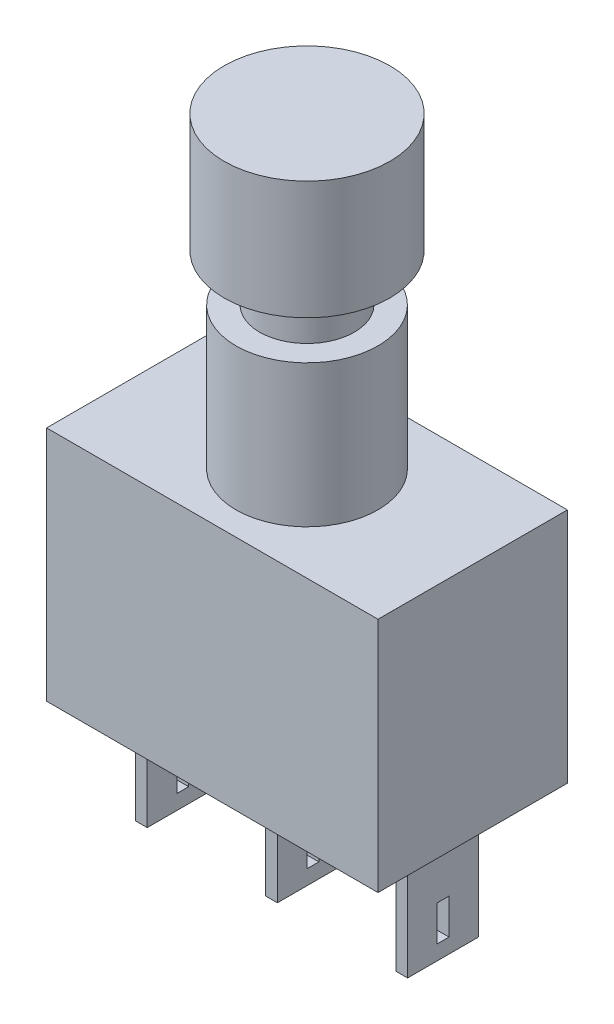
ISO-10303-21;
HEADER;
FILE_DESCRIPTION(('STEP AP214'),'2;1');
FILE_NAME('part.step','',(''),(''),'','','');
FILE_SCHEMA(('AUTOMOTIVE_DESIGN { 1 0 10303 214 1 1 1 1 }'));
ENDSEC;
DATA;
#1=APPLICATION_CONTEXT('core data for automotive mechanical design processes');
#2=APPLICATION_PROTOCOL_DEFINITION('international standard','automotive_design',2000,#1);
#3=PRODUCT_CONTEXT('',#1,'mechanical');
#4=PRODUCT('Part','Part','',(#3));
#5=PRODUCT_RELATED_PRODUCT_CATEGORY('part','',(#4));
#6=PRODUCT_DEFINITION_FORMATION('','',#4);
#7=PRODUCT_DEFINITION_CONTEXT('part definition',#1,'design');
#8=PRODUCT_DEFINITION('design','',#6,#7);
#9=PRODUCT_DEFINITION_SHAPE('','',#8);
#10=(LENGTH_UNIT() NAMED_UNIT(*) SI_UNIT(.MILLI.,.METRE.));
#11=(NAMED_UNIT(*) PLANE_ANGLE_UNIT() SI_UNIT($,.RADIAN.));
#12=(NAMED_UNIT(*) SI_UNIT($,.STERADIAN.) SOLID_ANGLE_UNIT());
#13=UNCERTAINTY_MEASURE_WITH_UNIT(LENGTH_MEASURE(1.E-05),#10,'distance_accuracy_value','');
#14=(GEOMETRIC_REPRESENTATION_CONTEXT(3) GLOBAL_UNCERTAINTY_ASSIGNED_CONTEXT((#13)) GLOBAL_UNIT_ASSIGNED_CONTEXT((#10,
#11,#12)) REPRESENTATION_CONTEXT('',''));
#15=CARTESIAN_POINT('',(0.,0.,0.));
#16=DIRECTION('',(0.,0.,1.));
#17=DIRECTION('',(1.,0.,0.));
#18=AXIS2_PLACEMENT_3D('',#15,#16,#17);
#19=CARTESIAN_POINT('',(-7.,0.,4.));
#20=DIRECTION('',(0.,1.,0.));
#21=DIRECTION('',(0.,0.,1.));
#22=AXIS2_PLACEMENT_3D('',#19,#20,#21);
#23=PLANE('',#22);
#24=DIRECTION('',(0.,0.,1.));
#25=VECTOR('',#24,1.);
#26=CARTESIAN_POINT('',(5.75,0.,1.5));
#27=LINE('',#26,#25);
#28=CARTESIAN_POINT('',(5.75,0.,-1.5));
#29=VERTEX_POINT('',#28);
#30=CARTESIAN_POINT('',(5.75,0.,1.5));
#31=VERTEX_POINT('',#30);
#32=EDGE_CURVE('E347',#29,#31,#27,.T.);
#33=ORIENTED_EDGE('',*,*,#32,.F.);
#34=DIRECTION('',(1.,0.,0.));
#35=VECTOR('',#34,1.);
#36=CARTESIAN_POINT('',(5.75,0.,-1.5));
#37=LINE('',#36,#35);
#38=CARTESIAN_POINT('',(5.25,0.,-1.5));
#39=VERTEX_POINT('',#38);
#40=EDGE_CURVE('E356',#39,#29,#37,.T.);
#41=ORIENTED_EDGE('',*,*,#40,.F.);
#42=DIRECTION('',(0.,0.,-1.));
#43=VECTOR('',#42,1.);
#44=CARTESIAN_POINT('',(5.25,0.,1.5));
#45=LINE('',#44,#43);
#46=CARTESIAN_POINT('',(5.25,0.,1.5));
#47=VERTEX_POINT('',#46);
#48=EDGE_CURVE('E353',#47,#39,#45,.T.);
#49=ORIENTED_EDGE('',*,*,#48,.F.);
#50=DIRECTION('',(-1.,0.,0.));
#51=VECTOR('',#50,1.);
#52=CARTESIAN_POINT('',(5.75,0.,1.5));
#53=LINE('',#52,#51);
#54=EDGE_CURVE('E350',#31,#47,#53,.T.);
#55=ORIENTED_EDGE('',*,*,#54,.F.);
#56=EDGE_LOOP('',(#33,#41,#49,#55));
#57=FACE_BOUND('',#56,.T.);
#58=DIRECTION('',(0.,0.,1.));
#59=VECTOR('',#58,1.);
#60=CARTESIAN_POINT('',(-7.,0.,-4.));
#61=LINE('',#60,#59);
#62=CARTESIAN_POINT('',(-7.,0.,-4.));
#63=VERTEX_POINT('',#62);
#64=CARTESIAN_POINT('',(-7.,0.,4.));
#65=VERTEX_POINT('',#64);
#66=EDGE_CURVE('E431',#63,#65,#61,.T.);
#67=ORIENTED_EDGE('',*,*,#66,.F.);
#68=DIRECTION('',(-1.,0.,0.));
#69=VECTOR('',#68,1.);
#70=CARTESIAN_POINT('',(-7.,0.,-4.));
#71=LINE('',#70,#69);
#72=CARTESIAN_POINT('',(7.,0.,-4.));
#73=VERTEX_POINT('',#72);
#74=EDGE_CURVE('E438',#73,#63,#71,.T.);
#75=ORIENTED_EDGE('',*,*,#74,.F.);
#76=DIRECTION('',(0.,0.,-1.));
#77=VECTOR('',#76,1.);
#78=CARTESIAN_POINT('',(7.,0.,-4.));
#79=LINE('',#78,#77);
#80=CARTESIAN_POINT('',(7.,0.,4.));
#81=VERTEX_POINT('',#80);
#82=EDGE_CURVE('E436',#81,#73,#79,.T.);
#83=ORIENTED_EDGE('',*,*,#82,.F.);
#84=DIRECTION('',(1.,0.,0.));
#85=VECTOR('',#84,1.);
#86=CARTESIAN_POINT('',(-7.,0.,4.));
#87=LINE('',#86,#85);
#88=EDGE_CURVE('E434',#65,#81,#87,.T.);
#89=ORIENTED_EDGE('',*,*,#88,.F.);
#90=EDGE_LOOP('',(#67,#75,#83,#89));
#91=FACE_BOUND('',#90,.T.);
#92=DIRECTION('',(0.,0.,1.));
#93=VECTOR('',#92,1.);
#94=CARTESIAN_POINT('',(0.25,0.,1.5));
#95=LINE('',#94,#93);
#96=CARTESIAN_POINT('',(0.25,0.,-1.5));
#97=VERTEX_POINT('',#96);
#98=CARTESIAN_POINT('',(0.25,0.,1.5));
#99=VERTEX_POINT('',#98);
#100=EDGE_CURVE('E380',#97,#99,#95,.T.);
#101=ORIENTED_EDGE('',*,*,#100,.F.);
#102=DIRECTION('',(1.,0.,0.));
#103=VECTOR('',#102,1.);
#104=CARTESIAN_POINT('',(0.25,0.,-1.5));
#105=LINE('',#104,#103);
#106=CARTESIAN_POINT('',(-0.25,0.,-1.5));
#107=VERTEX_POINT('',#106);
#108=EDGE_CURVE('E389',#107,#97,#105,.T.);
#109=ORIENTED_EDGE('',*,*,#108,.F.);
#110=DIRECTION('',(0.,0.,-1.));
#111=VECTOR('',#110,1.);
#112=CARTESIAN_POINT('',(-0.25,0.,1.5));
#113=LINE('',#112,#111);
#114=CARTESIAN_POINT('',(-0.25,0.,1.5));
#115=VERTEX_POINT('',#114);
#116=EDGE_CURVE('E386',#115,#107,#113,.T.);
#117=ORIENTED_EDGE('',*,*,#116,.F.);
#118=DIRECTION('',(-1.,0.,0.));
#119=VECTOR('',#118,1.);
#120=CARTESIAN_POINT('',(0.25,0.,1.5));
#121=LINE('',#120,#119);
#122=EDGE_CURVE('E383',#99,#115,#121,.T.);
#123=ORIENTED_EDGE('',*,*,#122,.F.);
#124=EDGE_LOOP('',(#101,#109,#117,#123));
#125=FACE_BOUND('',#124,.T.);
#126=DIRECTION('',(0.,0.,1.));
#127=VECTOR('',#126,1.);
#128=CARTESIAN_POINT('',(-5.25,0.,1.5));
#129=LINE('',#128,#127);
#130=CARTESIAN_POINT('',(-5.25,0.,-1.5));
#131=VERTEX_POINT('',#130);
#132=CARTESIAN_POINT('',(-5.25,0.,1.5));
#133=VERTEX_POINT('',#132);
#134=EDGE_CURVE('E314',#131,#133,#129,.T.);
#135=ORIENTED_EDGE('',*,*,#134,.F.);
#136=DIRECTION('',(1.,0.,0.));
#137=VECTOR('',#136,1.);
#138=CARTESIAN_POINT('',(-5.25,0.,-1.5));
#139=LINE('',#138,#137);
#140=CARTESIAN_POINT('',(-5.75,0.,-1.5));
#141=VERTEX_POINT('',#140);
#142=EDGE_CURVE('E323',#141,#131,#139,.T.);
#143=ORIENTED_EDGE('',*,*,#142,.F.);
#144=DIRECTION('',(0.,0.,-1.));
#145=VECTOR('',#144,1.);
#146=CARTESIAN_POINT('',(-5.75,0.,1.5));
#147=LINE('',#146,#145);
#148=CARTESIAN_POINT('',(-5.75,0.,1.5));
#149=VERTEX_POINT('',#148);
#150=EDGE_CURVE('E320',#149,#141,#147,.T.);
#151=ORIENTED_EDGE('',*,*,#150,.F.);
#152=DIRECTION('',(-1.,0.,0.));
#153=VECTOR('',#152,1.);
#154=CARTESIAN_POINT('',(-5.25,0.,1.5));
#155=LINE('',#154,#153);
#156=EDGE_CURVE('E317',#133,#149,#155,.T.);
#157=ORIENTED_EDGE('',*,*,#156,.F.);
#158=EDGE_LOOP('',(#135,#143,#151,#157));
#159=FACE_BOUND('',#158,.T.);
#160=ADVANCED_FACE('F32',(#57,#91,#125,#159),#23,.F.);
#161=CARTESIAN_POINT('',(0.,16.,0.));
#162=DIRECTION('',(0.,1.,0.));
#163=DIRECTION('',(0.,0.,1.));
#164=AXIS2_PLACEMENT_3D('',#161,#162,#163);
#165=PLANE('',#164);
#166=CARTESIAN_POINT('',(0.,16.,0.));
#167=DIRECTION('',(0.,1.,0.));
#168=DIRECTION('',(0.,0.,1.));
#169=AXIS2_PLACEMENT_3D('',#166,#167,#168);
#170=CIRCLE('',#169,3.);
#171=CARTESIAN_POINT('',(0.,16.,3.));
#172=VERTEX_POINT('',#171);
#173=EDGE_CURVE('E428',#172,#172,#170,.T.);
#174=ORIENTED_EDGE('',*,*,#173,.T.);
#175=EDGE_LOOP('',(#174));
#176=FACE_BOUND('',#175,.T.);
#177=CARTESIAN_POINT('',(0.,16.,0.));
#178=DIRECTION('',(0.,1.,0.));
#179=DIRECTION('',(0.,0.,1.));
#180=AXIS2_PLACEMENT_3D('',#177,#178,#179);
#181=CIRCLE('',#180,2.);
#182=CARTESIAN_POINT('',(0.,16.,2.));
#183=VERTEX_POINT('',#182);
#184=EDGE_CURVE('E419',#183,#183,#181,.T.);
#185=ORIENTED_EDGE('',*,*,#184,.F.);
#186=EDGE_LOOP('',(#185));
#187=FACE_BOUND('',#186,.T.);
#188=ADVANCED_FACE('F484',(#176,#187),#165,.T.);
#189=CARTESIAN_POINT('',(-7.,10.,4.));
#190=DIRECTION('',(0.,1.,0.));
#191=DIRECTION('',(0.,0.,1.));
#192=AXIS2_PLACEMENT_3D('',#189,#190,#191);
#193=PLANE('',#192);
#194=DIRECTION('',(0.,0.,1.));
#195=VECTOR('',#194,1.);
#196=CARTESIAN_POINT('',(-7.,10.,-4.));
#197=LINE('',#196,#195);
#198=CARTESIAN_POINT('',(-7.,10.,-4.));
#199=VERTEX_POINT('',#198);
#200=CARTESIAN_POINT('',(-7.,10.,4.));
#201=VERTEX_POINT('',#200);
#202=EDGE_CURVE('E440',#199,#201,#197,.T.);
#203=ORIENTED_EDGE('',*,*,#202,.T.);
#204=DIRECTION('',(1.,0.,0.));
#205=VECTOR('',#204,1.);
#206=CARTESIAN_POINT('',(-7.,10.,4.));
#207=LINE('',#206,#205);
#208=CARTESIAN_POINT('',(7.,10.,4.));
#209=VERTEX_POINT('',#208);
#210=EDGE_CURVE('E443',#201,#209,#207,.T.);
#211=ORIENTED_EDGE('',*,*,#210,.T.);
#212=DIRECTION('',(0.,0.,-1.));
#213=VECTOR('',#212,1.);
#214=CARTESIAN_POINT('',(7.,10.,-4.));
#215=LINE('',#214,#213);
#216=CARTESIAN_POINT('',(7.,10.,-4.));
#217=VERTEX_POINT('',#216);
#218=EDGE_CURVE('E445',#209,#217,#215,.T.);
#219=ORIENTED_EDGE('',*,*,#218,.T.);
#220=DIRECTION('',(-1.,0.,0.));
#221=VECTOR('',#220,1.);
#222=CARTESIAN_POINT('',(-7.,10.,-4.));
#223=LINE('',#222,#221);
#224=EDGE_CURVE('E447',#217,#199,#223,.T.);
#225=ORIENTED_EDGE('',*,*,#224,.T.);
#226=EDGE_LOOP('',(#203,#211,#219,#225));
#227=FACE_BOUND('',#226,.T.);
#228=CARTESIAN_POINT('',(0.,10.,0.));
#229=DIRECTION('',(0.,1.,0.));
#230=DIRECTION('',(0.,0.,1.));
#231=AXIS2_PLACEMENT_3D('',#228,#229,#230);
#232=CIRCLE('',#231,3.);
#233=CARTESIAN_POINT('',(0.,10.,3.));
#234=VERTEX_POINT('',#233);
#235=EDGE_CURVE('E425',#234,#234,#232,.T.);
#236=ORIENTED_EDGE('',*,*,#235,.F.);
#237=EDGE_LOOP('',(#236));
#238=FACE_BOUND('',#237,.T.);
#239=ADVANCED_FACE('F474',(#227,#238),#193,.T.);
#240=CARTESIAN_POINT('',(-7.,10.,-4.));
#241=DIRECTION('',(1.,0.,0.));
#242=DIRECTION('',(0.,0.,-1.));
#243=AXIS2_PLACEMENT_3D('',#240,#241,#242);
#244=PLANE('',#243);
#245=ORIENTED_EDGE('',*,*,#66,.T.);
#246=DIRECTION('',(0.,-1.,0.));
#247=VECTOR('',#246,1.);
#248=CARTESIAN_POINT('',(-7.,10.,4.));
#249=LINE('',#248,#247);
#250=EDGE_CURVE('E11',#201,#65,#249,.T.);
#251=ORIENTED_EDGE('',*,*,#250,.F.);
#252=ORIENTED_EDGE('',*,*,#202,.F.);
#253=DIRECTION('',(0.,-1.,0.));
#254=VECTOR('',#253,1.);
#255=CARTESIAN_POINT('',(-7.,10.,-4.));
#256=LINE('',#255,#254);
#257=EDGE_CURVE('E449',#199,#63,#256,.T.);
#258=ORIENTED_EDGE('',*,*,#257,.T.);
#259=EDGE_LOOP('',(#245,#251,#252,#258));
#260=FACE_BOUND('',#259,.T.);
#261=ADVANCED_FACE('F34',(#260),#244,.F.);
#262=CARTESIAN_POINT('',(-7.,10.,4.));
#263=DIRECTION('',(0.,0.,-1.));
#264=DIRECTION('',(-1.,0.,0.));
#265=AXIS2_PLACEMENT_3D('',#262,#263,#264);
#266=PLANE('',#265);
#267=ORIENTED_EDGE('',*,*,#88,.T.);
#268=DIRECTION('',(0.,-1.,0.));
#269=VECTOR('',#268,1.);
#270=CARTESIAN_POINT('',(7.,10.,4.));
#271=LINE('',#270,#269);
#272=EDGE_CURVE('E40',#209,#81,#271,.T.);
#273=ORIENTED_EDGE('',*,*,#272,.F.);
#274=ORIENTED_EDGE('',*,*,#210,.F.);
#275=ORIENTED_EDGE('',*,*,#250,.T.);
#276=EDGE_LOOP('',(#267,#273,#274,#275));
#277=FACE_BOUND('',#276,.T.);
#278=ADVANCED_FACE('F476',(#277),#266,.F.);
#279=CARTESIAN_POINT('',(7.,10.,-4.));
#280=DIRECTION('',(-1.,0.,0.));
#281=DIRECTION('',(0.,0.,1.));
#282=AXIS2_PLACEMENT_3D('',#279,#280,#281);
#283=PLANE('',#282);
#284=ORIENTED_EDGE('',*,*,#82,.T.);
#285=DIRECTION('',(0.,-1.,0.));
#286=VECTOR('',#285,1.);
#287=CARTESIAN_POINT('',(7.,10.,-4.));
#288=LINE('',#287,#286);
#289=EDGE_CURVE('E452',#217,#73,#288,.T.);
#290=ORIENTED_EDGE('',*,*,#289,.F.);
#291=ORIENTED_EDGE('',*,*,#218,.F.);
#292=ORIENTED_EDGE('',*,*,#272,.T.);
#293=EDGE_LOOP('',(#284,#290,#291,#292));
#294=FACE_BOUND('',#293,.T.);
#295=ADVANCED_FACE('F459',(#294),#283,.F.);
#296=CARTESIAN_POINT('',(-7.,10.,-4.));
#297=DIRECTION('',(0.,0.,1.));
#298=DIRECTION('',(1.,0.,0.));
#299=AXIS2_PLACEMENT_3D('',#296,#297,#298);
#300=PLANE('',#299);
#301=ORIENTED_EDGE('',*,*,#74,.T.);
#302=ORIENTED_EDGE('',*,*,#257,.F.);
#303=ORIENTED_EDGE('',*,*,#224,.F.);
#304=ORIENTED_EDGE('',*,*,#289,.T.);
#305=EDGE_LOOP('',(#301,#302,#303,#304));
#306=FACE_BOUND('',#305,.T.);
#307=ADVANCED_FACE('F468',(#306),#300,.F.);
#308=CARTESIAN_POINT('',(0.,16.,0.));
#309=DIRECTION('',(0.,-1.,0.));
#310=DIRECTION('',(0.,0.,-1.));
#311=AXIS2_PLACEMENT_3D('',#308,#309,#310);
#312=CYLINDRICAL_SURFACE('',#311,3.);
#313=ORIENTED_EDGE('',*,*,#173,.F.);
#314=EDGE_LOOP('',(#313));
#315=FACE_BOUND('',#314,.T.);
#316=ORIENTED_EDGE('',*,*,#235,.T.);
#317=EDGE_LOOP('',(#316));
#318=FACE_BOUND('',#317,.T.);
#319=ADVANCED_FACE('F494',(#315,#318),#312,.T.);
#320=CARTESIAN_POINT('',(0.,18.,0.));
#321=DIRECTION('',(0.,-1.,0.));
#322=DIRECTION('',(0.,0.,-1.));
#323=AXIS2_PLACEMENT_3D('',#320,#321,#322);
#324=CYLINDRICAL_SURFACE('',#323,2.);
#325=CARTESIAN_POINT('',(0.,18.,0.));
#326=DIRECTION('',(0.,1.,0.));
#327=DIRECTION('',(0.,0.,1.));
#328=AXIS2_PLACEMENT_3D('',#325,#326,#327);
#329=CIRCLE('',#328,2.);
#330=CARTESIAN_POINT('',(0.,18.,2.));
#331=VERTEX_POINT('',#330);
#332=EDGE_CURVE('E422',#331,#331,#329,.T.);
#333=ORIENTED_EDGE('',*,*,#332,.F.);
#334=EDGE_LOOP('',(#333));
#335=FACE_BOUND('',#334,.T.);
#336=ORIENTED_EDGE('',*,*,#184,.T.);
#337=EDGE_LOOP('',(#336));
#338=FACE_BOUND('',#337,.T.);
#339=ADVANCED_FACE('F501',(#335,#338),#324,.T.);
#340=CARTESIAN_POINT('',(0.,18.,0.));
#341=DIRECTION('',(0.,1.,0.));
#342=DIRECTION('',(0.,0.,1.));
#343=AXIS2_PLACEMENT_3D('',#340,#341,#342);
#344=PLANE('',#343);
#345=CARTESIAN_POINT('',(0.,18.,0.));
#346=DIRECTION('',(0.,1.,0.));
#347=DIRECTION('',(0.,0.,1.));
#348=AXIS2_PLACEMENT_3D('',#345,#346,#347);
#349=CIRCLE('',#348,3.5);
#350=CARTESIAN_POINT('',(0.,18.,3.5));
#351=VERTEX_POINT('',#350);
#352=EDGE_CURVE('E413',#351,#351,#349,.T.);
#353=ORIENTED_EDGE('',*,*,#352,.F.);
#354=EDGE_LOOP('',(#353));
#355=FACE_BOUND('',#354,.T.);
#356=ORIENTED_EDGE('',*,*,#332,.T.);
#357=EDGE_LOOP('',(#356));
#358=FACE_BOUND('',#357,.T.);
#359=ADVANCED_FACE('F506',(#355,#358),#344,.F.);
#360=CARTESIAN_POINT('',(0.,23.,0.));
#361=DIRECTION('',(0.,-1.,0.));
#362=DIRECTION('',(0.,0.,-1.));
#363=AXIS2_PLACEMENT_3D('',#360,#361,#362);
#364=CYLINDRICAL_SURFACE('',#363,3.5);
#365=CARTESIAN_POINT('',(0.,23.,0.));
#366=DIRECTION('',(0.,1.,0.));
#367=DIRECTION('',(0.,0.,1.));
#368=AXIS2_PLACEMENT_3D('',#365,#366,#367);
#369=CIRCLE('',#368,3.5);
#370=CARTESIAN_POINT('',(0.,23.,3.5));
#371=VERTEX_POINT('',#370);
#372=EDGE_CURVE('E416',#371,#371,#369,.T.);
#373=ORIENTED_EDGE('',*,*,#372,.F.);
#374=EDGE_LOOP('',(#373));
#375=FACE_BOUND('',#374,.T.);
#376=ORIENTED_EDGE('',*,*,#352,.T.);
#377=EDGE_LOOP('',(#376));
#378=FACE_BOUND('',#377,.T.);
#379=ADVANCED_FACE('F518',(#375,#378),#364,.T.);
#380=CARTESIAN_POINT('',(0.,23.,0.));
#381=DIRECTION('',(0.,1.,0.));
#382=DIRECTION('',(0.,0.,1.));
#383=AXIS2_PLACEMENT_3D('',#380,#381,#382);
#384=PLANE('',#383);
#385=ORIENTED_EDGE('',*,*,#372,.T.);
#386=EDGE_LOOP('',(#385));
#387=FACE_BOUND('',#386,.T.);
#388=ADVANCED_FACE('F525',(#387),#384,.T.);
#389=CARTESIAN_POINT('',(0.25,-5.,1.5));
#390=DIRECTION('',(-1.,0.,0.));
#391=DIRECTION('',(0.,0.,1.));
#392=AXIS2_PLACEMENT_3D('',#389,#390,#391);
#393=PLANE('',#392);
#394=DIRECTION('',(0.,0.,-1.));
#395=VECTOR('',#394,1.);
#396=CARTESIAN_POINT('',(0.25,-2.87672510658426,1.5));
#397=LINE('',#396,#395);
#398=CARTESIAN_POINT('',(0.250000000000002,-2.87672510658426,0.25));
#399=VERTEX_POINT('',#398);
#400=CARTESIAN_POINT('',(0.250000000000002,-2.87672510658426,-0.25));
#401=VERTEX_POINT('',#400);
#402=EDGE_CURVE('E296',#399,#401,#397,.T.);
#403=ORIENTED_EDGE('',*,*,#402,.T.);
#404=DIRECTION('',(0.,-1.,0.));
#405=VECTOR('',#404,1.);
#406=CARTESIAN_POINT('',(0.25,-5.,-0.25));
#407=LINE('',#406,#405);
#408=CARTESIAN_POINT('',(0.250000000000002,-4.37672510658426,-0.25));
#409=VERTEX_POINT('',#408);
#410=EDGE_CURVE('E311',#401,#409,#407,.T.);
#411=ORIENTED_EDGE('',*,*,#410,.T.);
#412=DIRECTION('',(0.,0.,1.));
#413=VECTOR('',#412,1.);
#414=CARTESIAN_POINT('',(0.25,-4.37672510658426,1.5));
#415=LINE('',#414,#413);
#416=CARTESIAN_POINT('',(0.25,-4.37672510658426,0.25));
#417=VERTEX_POINT('',#416);
#418=EDGE_CURVE('E268',#409,#417,#415,.T.);
#419=ORIENTED_EDGE('',*,*,#418,.T.);
#420=DIRECTION('',(0.,1.,0.));
#421=VECTOR('',#420,1.);
#422=CARTESIAN_POINT('',(0.25,-5.,0.25));
#423=LINE('',#422,#421);
#424=EDGE_CURVE('E281',#417,#399,#423,.T.);
#425=ORIENTED_EDGE('',*,*,#424,.T.);
#426=EDGE_LOOP('',(#403,#411,#419,#425));
#427=FACE_BOUND('',#426,.T.);
#428=ORIENTED_EDGE('',*,*,#100,.T.);
#429=DIRECTION('',(0.,1.,0.));
#430=VECTOR('',#429,1.);
#431=CARTESIAN_POINT('',(0.25,-5.,1.5));
#432=LINE('',#431,#430);
#433=CARTESIAN_POINT('',(0.25,-5.,1.5));
#434=VERTEX_POINT('',#433);
#435=EDGE_CURVE('E410',#434,#99,#432,.T.);
#436=ORIENTED_EDGE('',*,*,#435,.F.);
#437=DIRECTION('',(0.,0.,1.));
#438=VECTOR('',#437,1.);
#439=CARTESIAN_POINT('',(0.25,-5.,1.5));
#440=LINE('',#439,#438);
#441=CARTESIAN_POINT('',(0.25,-5.,-1.5));
#442=VERTEX_POINT('',#441);
#443=EDGE_CURVE('E392',#442,#434,#440,.T.);
#444=ORIENTED_EDGE('',*,*,#443,.F.);
#445=DIRECTION('',(0.,1.,0.));
#446=VECTOR('',#445,1.);
#447=CARTESIAN_POINT('',(0.25,-5.,-1.5));
#448=LINE('',#447,#446);
#449=EDGE_CURVE('E401',#442,#97,#448,.T.);
#450=ORIENTED_EDGE('',*,*,#449,.T.);
#451=EDGE_LOOP('',(#428,#436,#444,#450));
#452=FACE_BOUND('',#451,.T.);
#453=ADVANCED_FACE('F528',(#427,#452),#393,.F.);
#454=CARTESIAN_POINT('',(0.25,-5.,1.5));
#455=DIRECTION('',(0.,0.,-1.));
#456=DIRECTION('',(-1.,0.,0.));
#457=AXIS2_PLACEMENT_3D('',#454,#455,#456);
#458=PLANE('',#457);
#459=ORIENTED_EDGE('',*,*,#122,.T.);
#460=DIRECTION('',(0.,1.,0.));
#461=VECTOR('',#460,1.);
#462=CARTESIAN_POINT('',(-0.25,-5.,1.5));
#463=LINE('',#462,#461);
#464=CARTESIAN_POINT('',(-0.25,-5.,1.5));
#465=VERTEX_POINT('',#464);
#466=EDGE_CURVE('E407',#465,#115,#463,.T.);
#467=ORIENTED_EDGE('',*,*,#466,.F.);
#468=DIRECTION('',(-1.,0.,0.));
#469=VECTOR('',#468,1.);
#470=CARTESIAN_POINT('',(0.25,-5.,1.5));
#471=LINE('',#470,#469);
#472=EDGE_CURVE('E395',#434,#465,#471,.T.);
#473=ORIENTED_EDGE('',*,*,#472,.F.);
#474=ORIENTED_EDGE('',*,*,#435,.T.);
#475=EDGE_LOOP('',(#459,#467,#473,#474));
#476=FACE_BOUND('',#475,.T.);
#477=ADVANCED_FACE('F533',(#476),#458,.F.);
#478=CARTESIAN_POINT('',(-0.25,-5.,1.5));
#479=DIRECTION('',(1.,0.,0.));
#480=DIRECTION('',(0.,0.,-1.));
#481=AXIS2_PLACEMENT_3D('',#478,#479,#480);
#482=PLANE('',#481);
#483=DIRECTION('',(0.,0.,-1.));
#484=VECTOR('',#483,1.);
#485=CARTESIAN_POINT('',(-0.25,-4.37672510658426,1.5));
#486=LINE('',#485,#484);
#487=CARTESIAN_POINT('',(-0.249999999999999,-4.37672510658426,0.25));
#488=VERTEX_POINT('',#487);
#489=CARTESIAN_POINT('',(-0.25,-4.37672510658426,-0.25));
#490=VERTEX_POINT('',#489);
#491=EDGE_CURVE('E265',#488,#490,#486,.T.);
#492=ORIENTED_EDGE('',*,*,#491,.T.);
#493=DIRECTION('',(0.,1.,0.));
#494=VECTOR('',#493,1.);
#495=CARTESIAN_POINT('',(-0.25,-5.,-0.25));
#496=LINE('',#495,#494);
#497=CARTESIAN_POINT('',(-0.249999999999999,-2.87672510658426,-0.25));
#498=VERTEX_POINT('',#497);
#499=EDGE_CURVE('E308',#490,#498,#496,.T.);
#500=ORIENTED_EDGE('',*,*,#499,.T.);
#501=DIRECTION('',(0.,0.,1.));
#502=VECTOR('',#501,1.);
#503=CARTESIAN_POINT('',(-0.25,-2.87672510658426,1.5));
#504=LINE('',#503,#502);
#505=CARTESIAN_POINT('',(-0.249999999999999,-2.87672510658426,0.25));
#506=VERTEX_POINT('',#505);
#507=EDGE_CURVE('E293',#498,#506,#504,.T.);
#508=ORIENTED_EDGE('',*,*,#507,.T.);
#509=DIRECTION('',(0.,-1.,0.));
#510=VECTOR('',#509,1.);
#511=CARTESIAN_POINT('',(-0.25,-5.,0.25));
#512=LINE('',#511,#510);
#513=EDGE_CURVE('E278',#506,#488,#512,.T.);
#514=ORIENTED_EDGE('',*,*,#513,.T.);
#515=EDGE_LOOP('',(#492,#500,#508,#514));
#516=FACE_BOUND('',#515,.T.);
#517=ORIENTED_EDGE('',*,*,#116,.T.);
#518=DIRECTION('',(0.,1.,0.));
#519=VECTOR('',#518,1.);
#520=CARTESIAN_POINT('',(-0.25,-5.,-1.5));
#521=LINE('',#520,#519);
#522=CARTESIAN_POINT('',(-0.25,-5.,-1.5));
#523=VERTEX_POINT('',#522);
#524=EDGE_CURVE('E404',#523,#107,#521,.T.);
#525=ORIENTED_EDGE('',*,*,#524,.F.);
#526=DIRECTION('',(0.,0.,-1.));
#527=VECTOR('',#526,1.);
#528=CARTESIAN_POINT('',(-0.25,-5.,1.5));
#529=LINE('',#528,#527);
#530=EDGE_CURVE('E397',#465,#523,#529,.T.);
#531=ORIENTED_EDGE('',*,*,#530,.F.);
#532=ORIENTED_EDGE('',*,*,#466,.T.);
#533=EDGE_LOOP('',(#517,#525,#531,#532));
#534=FACE_BOUND('',#533,.T.);
#535=ADVANCED_FACE('F537',(#516,#534),#482,.F.);
#536=CARTESIAN_POINT('',(0.25,-5.,-1.5));
#537=DIRECTION('',(0.,0.,1.));
#538=DIRECTION('',(1.,0.,0.));
#539=AXIS2_PLACEMENT_3D('',#536,#537,#538);
#540=PLANE('',#539);
#541=ORIENTED_EDGE('',*,*,#108,.T.);
#542=ORIENTED_EDGE('',*,*,#449,.F.);
#543=DIRECTION('',(1.,0.,0.));
#544=VECTOR('',#543,1.);
#545=CARTESIAN_POINT('',(0.25,-5.,-1.5));
#546=LINE('',#545,#544);
#547=EDGE_CURVE('E399',#523,#442,#546,.T.);
#548=ORIENTED_EDGE('',*,*,#547,.F.);
#549=ORIENTED_EDGE('',*,*,#524,.T.);
#550=EDGE_LOOP('',(#541,#542,#548,#549));
#551=FACE_BOUND('',#550,.T.);
#552=ADVANCED_FACE('F541',(#551),#540,.F.);
#553=CARTESIAN_POINT('',(0.25,-5.,-1.5));
#554=DIRECTION('',(0.,1.,0.));
#555=DIRECTION('',(0.,0.,1.));
#556=AXIS2_PLACEMENT_3D('',#553,#554,#555);
#557=PLANE('',#556);
#558=ORIENTED_EDGE('',*,*,#443,.T.);
#559=ORIENTED_EDGE('',*,*,#472,.T.);
#560=ORIENTED_EDGE('',*,*,#530,.T.);
#561=ORIENTED_EDGE('',*,*,#547,.T.);
#562=EDGE_LOOP('',(#558,#559,#560,#561));
#563=FACE_BOUND('',#562,.T.);
#564=ADVANCED_FACE('F545',(#563),#557,.F.);
#565=CARTESIAN_POINT('',(5.75,-5.,1.5));
#566=DIRECTION('',(-1.,0.,0.));
#567=DIRECTION('',(0.,0.,1.));
#568=AXIS2_PLACEMENT_3D('',#565,#566,#567);
#569=PLANE('',#568);
#570=DIRECTION('',(0.,0.,-1.));
#571=VECTOR('',#570,1.);
#572=CARTESIAN_POINT('',(5.75,-2.87672510658426,1.5));
#573=LINE('',#572,#571);
#574=CARTESIAN_POINT('',(5.75,-2.87672510658426,0.25));
#575=VERTEX_POINT('',#574);
#576=CARTESIAN_POINT('',(5.75,-2.87672510658426,-0.25));
#577=VERTEX_POINT('',#576);
#578=EDGE_CURVE('E290',#575,#577,#573,.T.);
#579=ORIENTED_EDGE('',*,*,#578,.T.);
#580=DIRECTION('',(0.,-1.,0.));
#581=VECTOR('',#580,1.);
#582=CARTESIAN_POINT('',(5.75,-5.,-0.25));
#583=LINE('',#582,#581);
#584=CARTESIAN_POINT('',(5.75,-4.37672510658426,-0.25));
#585=VERTEX_POINT('',#584);
#586=EDGE_CURVE('E305',#577,#585,#583,.T.);
#587=ORIENTED_EDGE('',*,*,#586,.T.);
#588=DIRECTION('',(0.,0.,1.));
#589=VECTOR('',#588,1.);
#590=CARTESIAN_POINT('',(5.75,-4.37672510658426,1.5));
#591=LINE('',#590,#589);
#592=CARTESIAN_POINT('',(5.75,-4.37672510658426,0.25));
#593=VERTEX_POINT('',#592);
#594=EDGE_CURVE('E262',#585,#593,#591,.T.);
#595=ORIENTED_EDGE('',*,*,#594,.T.);
#596=DIRECTION('',(0.,1.,0.));
#597=VECTOR('',#596,1.);
#598=CARTESIAN_POINT('',(5.75,-5.,0.25));
#599=LINE('',#598,#597);
#600=EDGE_CURVE('E275',#593,#575,#599,.T.);
#601=ORIENTED_EDGE('',*,*,#600,.T.);
#602=EDGE_LOOP('',(#579,#587,#595,#601));
#603=FACE_BOUND('',#602,.T.);
#604=ORIENTED_EDGE('',*,*,#32,.T.);
#605=DIRECTION('',(0.,1.,0.));
#606=VECTOR('',#605,1.);
#607=CARTESIAN_POINT('',(5.75,-5.,1.5));
#608=LINE('',#607,#606);
#609=CARTESIAN_POINT('',(5.75,-5.,1.5));
#610=VERTEX_POINT('',#609);
#611=EDGE_CURVE('E377',#610,#31,#608,.T.);
#612=ORIENTED_EDGE('',*,*,#611,.F.);
#613=DIRECTION('',(0.,0.,1.));
#614=VECTOR('',#613,1.);
#615=CARTESIAN_POINT('',(5.75,-5.,1.5));
#616=LINE('',#615,#614);
#617=CARTESIAN_POINT('',(5.75,-5.,-1.5));
#618=VERTEX_POINT('',#617);
#619=EDGE_CURVE('E359',#618,#610,#616,.T.);
#620=ORIENTED_EDGE('',*,*,#619,.F.);
#621=DIRECTION('',(0.,1.,0.));
#622=VECTOR('',#621,1.);
#623=CARTESIAN_POINT('',(5.75,-5.,-1.5));
#624=LINE('',#623,#622);
#625=EDGE_CURVE('E368',#618,#29,#624,.T.);
#626=ORIENTED_EDGE('',*,*,#625,.T.);
#627=EDGE_LOOP('',(#604,#612,#620,#626));
#628=FACE_BOUND('',#627,.T.);
#629=ADVANCED_FACE('F549',(#603,#628),#569,.F.);
#630=CARTESIAN_POINT('',(5.75,-5.,1.5));
#631=DIRECTION('',(0.,0.,-1.));
#632=DIRECTION('',(-1.,0.,0.));
#633=AXIS2_PLACEMENT_3D('',#630,#631,#632);
#634=PLANE('',#633);
#635=ORIENTED_EDGE('',*,*,#54,.T.);
#636=DIRECTION('',(0.,1.,0.));
#637=VECTOR('',#636,1.);
#638=CARTESIAN_POINT('',(5.25,-5.,1.5));
#639=LINE('',#638,#637);
#640=CARTESIAN_POINT('',(5.25,-5.,1.5));
#641=VERTEX_POINT('',#640);
#642=EDGE_CURVE('E374',#641,#47,#639,.T.);
#643=ORIENTED_EDGE('',*,*,#642,.F.);
#644=DIRECTION('',(-1.,0.,0.));
#645=VECTOR('',#644,1.);
#646=CARTESIAN_POINT('',(5.75,-5.,1.5));
#647=LINE('',#646,#645);
#648=EDGE_CURVE('E362',#610,#641,#647,.T.);
#649=ORIENTED_EDGE('',*,*,#648,.F.);
#650=ORIENTED_EDGE('',*,*,#611,.T.);
#651=EDGE_LOOP('',(#635,#643,#649,#650));
#652=FACE_BOUND('',#651,.T.);
#653=ADVANCED_FACE('F553',(#652),#634,.F.);
#654=CARTESIAN_POINT('',(5.25,-5.,1.5));
#655=DIRECTION('',(1.,0.,0.));
#656=DIRECTION('',(0.,0.,-1.));
#657=AXIS2_PLACEMENT_3D('',#654,#655,#656);
#658=PLANE('',#657);
#659=DIRECTION('',(0.,0.,-1.));
#660=VECTOR('',#659,1.);
#661=CARTESIAN_POINT('',(5.25,-4.37672510658426,1.5));
#662=LINE('',#661,#660);
#663=CARTESIAN_POINT('',(5.25,-4.37672510658426,0.25));
#664=VERTEX_POINT('',#663);
#665=CARTESIAN_POINT('',(5.25,-4.37672510658426,-0.25));
#666=VERTEX_POINT('',#665);
#667=EDGE_CURVE('E259',#664,#666,#662,.T.);
#668=ORIENTED_EDGE('',*,*,#667,.T.);
#669=DIRECTION('',(0.,1.,0.));
#670=VECTOR('',#669,1.);
#671=CARTESIAN_POINT('',(5.25,-5.,-0.25));
#672=LINE('',#671,#670);
#673=CARTESIAN_POINT('',(5.25,-2.87672510658426,-0.25));
#674=VERTEX_POINT('',#673);
#675=EDGE_CURVE('E302',#666,#674,#672,.T.);
#676=ORIENTED_EDGE('',*,*,#675,.T.);
#677=DIRECTION('',(0.,0.,1.));
#678=VECTOR('',#677,1.);
#679=CARTESIAN_POINT('',(5.25,-2.87672510658426,1.5));
#680=LINE('',#679,#678);
#681=CARTESIAN_POINT('',(5.25,-2.87672510658426,0.25));
#682=VERTEX_POINT('',#681);
#683=EDGE_CURVE('E287',#674,#682,#680,.T.);
#684=ORIENTED_EDGE('',*,*,#683,.T.);
#685=DIRECTION('',(0.,-1.,0.));
#686=VECTOR('',#685,1.);
#687=CARTESIAN_POINT('',(5.25,-5.,0.25));
#688=LINE('',#687,#686);
#689=EDGE_CURVE('E272',#682,#664,#688,.T.);
#690=ORIENTED_EDGE('',*,*,#689,.T.);
#691=EDGE_LOOP('',(#668,#676,#684,#690));
#692=FACE_BOUND('',#691,.T.);
#693=ORIENTED_EDGE('',*,*,#48,.T.);
#694=DIRECTION('',(0.,1.,0.));
#695=VECTOR('',#694,1.);
#696=CARTESIAN_POINT('',(5.25,-5.,-1.5));
#697=LINE('',#696,#695);
#698=CARTESIAN_POINT('',(5.25,-5.,-1.5));
#699=VERTEX_POINT('',#698);
#700=EDGE_CURVE('E371',#699,#39,#697,.T.);
#701=ORIENTED_EDGE('',*,*,#700,.F.);
#702=DIRECTION('',(0.,0.,-1.));
#703=VECTOR('',#702,1.);
#704=CARTESIAN_POINT('',(5.25,-5.,1.5));
#705=LINE('',#704,#703);
#706=EDGE_CURVE('E364',#641,#699,#705,.T.);
#707=ORIENTED_EDGE('',*,*,#706,.F.);
#708=ORIENTED_EDGE('',*,*,#642,.T.);
#709=EDGE_LOOP('',(#693,#701,#707,#708));
#710=FACE_BOUND('',#709,.T.);
#711=ADVANCED_FACE('F557',(#692,#710),#658,.F.);
#712=CARTESIAN_POINT('',(5.75,-5.,-1.5));
#713=DIRECTION('',(0.,0.,1.));
#714=DIRECTION('',(1.,0.,0.));
#715=AXIS2_PLACEMENT_3D('',#712,#713,#714);
#716=PLANE('',#715);
#717=ORIENTED_EDGE('',*,*,#40,.T.);
#718=ORIENTED_EDGE('',*,*,#625,.F.);
#719=DIRECTION('',(1.,0.,0.));
#720=VECTOR('',#719,1.);
#721=CARTESIAN_POINT('',(5.75,-5.,-1.5));
#722=LINE('',#721,#720);
#723=EDGE_CURVE('E366',#699,#618,#722,.T.);
#724=ORIENTED_EDGE('',*,*,#723,.F.);
#725=ORIENTED_EDGE('',*,*,#700,.T.);
#726=EDGE_LOOP('',(#717,#718,#724,#725));
#727=FACE_BOUND('',#726,.T.);
#728=ADVANCED_FACE('F561',(#727),#716,.F.);
#729=CARTESIAN_POINT('',(5.75,-5.,1.5));
#730=DIRECTION('',(0.,1.,0.));
#731=DIRECTION('',(0.,0.,1.));
#732=AXIS2_PLACEMENT_3D('',#729,#730,#731);
#733=PLANE('',#732);
#734=ORIENTED_EDGE('',*,*,#619,.T.);
#735=ORIENTED_EDGE('',*,*,#648,.T.);
#736=ORIENTED_EDGE('',*,*,#706,.T.);
#737=ORIENTED_EDGE('',*,*,#723,.T.);
#738=EDGE_LOOP('',(#734,#735,#736,#737));
#739=FACE_BOUND('',#738,.T.);
#740=ADVANCED_FACE('F565',(#739),#733,.F.);
#741=CARTESIAN_POINT('',(-5.25,-5.,1.5));
#742=DIRECTION('',(-1.,0.,0.));
#743=DIRECTION('',(0.,0.,1.));
#744=AXIS2_PLACEMENT_3D('',#741,#742,#743);
#745=PLANE('',#744);
#746=DIRECTION('',(0.,0.,-1.));
#747=VECTOR('',#746,1.);
#748=CARTESIAN_POINT('',(-5.25,-2.87672510658426,1.5));
#749=LINE('',#748,#747);
#750=CARTESIAN_POINT('',(-5.25,-2.87672510658426,0.25));
#751=VERTEX_POINT('',#750);
#752=CARTESIAN_POINT('',(-5.25,-2.87672510658426,-0.25));
#753=VERTEX_POINT('',#752);
#754=EDGE_CURVE('E284',#751,#753,#749,.T.);
#755=ORIENTED_EDGE('',*,*,#754,.T.);
#756=DIRECTION('',(0.,-1.,0.));
#757=VECTOR('',#756,1.);
#758=CARTESIAN_POINT('',(-5.25,-5.,-0.25));
#759=LINE('',#758,#757);
#760=CARTESIAN_POINT('',(-5.25,-4.37672510658426,-0.25));
#761=VERTEX_POINT('',#760);
#762=EDGE_CURVE('E299',#753,#761,#759,.T.);
#763=ORIENTED_EDGE('',*,*,#762,.T.);
#764=DIRECTION('',(0.,0.,1.));
#765=VECTOR('',#764,1.);
#766=CARTESIAN_POINT('',(-5.25,-4.37672510658426,1.5));
#767=LINE('',#766,#765);
#768=CARTESIAN_POINT('',(-5.25,-4.37672510658426,0.25));
#769=VERTEX_POINT('',#768);
#770=EDGE_CURVE('E257',#761,#769,#767,.T.);
#771=ORIENTED_EDGE('',*,*,#770,.T.);
#772=DIRECTION('',(0.,1.,0.));
#773=VECTOR('',#772,1.);
#774=CARTESIAN_POINT('',(-5.25,-5.,0.25));
#775=LINE('',#774,#773);
#776=EDGE_CURVE('E224',#769,#751,#775,.T.);
#777=ORIENTED_EDGE('',*,*,#776,.T.);
#778=EDGE_LOOP('',(#755,#763,#771,#777));
#779=FACE_BOUND('',#778,.T.);
#780=ORIENTED_EDGE('',*,*,#134,.T.);
#781=DIRECTION('',(0.,1.,0.));
#782=VECTOR('',#781,1.);
#783=CARTESIAN_POINT('',(-5.25,-5.,1.5));
#784=LINE('',#783,#782);
#785=CARTESIAN_POINT('',(-5.25,-5.,1.5));
#786=VERTEX_POINT('',#785);
#787=EDGE_CURVE('E344',#786,#133,#784,.T.);
#788=ORIENTED_EDGE('',*,*,#787,.F.);
#789=DIRECTION('',(0.,0.,1.));
#790=VECTOR('',#789,1.);
#791=CARTESIAN_POINT('',(-5.25,-5.,1.5));
#792=LINE('',#791,#790);
#793=CARTESIAN_POINT('',(-5.25,-5.,-1.5));
#794=VERTEX_POINT('',#793);
#795=EDGE_CURVE('E326',#794,#786,#792,.T.);
#796=ORIENTED_EDGE('',*,*,#795,.F.);
#797=DIRECTION('',(0.,1.,0.));
#798=VECTOR('',#797,1.);
#799=CARTESIAN_POINT('',(-5.25,-5.,-1.5));
#800=LINE('',#799,#798);
#801=EDGE_CURVE('E335',#794,#131,#800,.T.);
#802=ORIENTED_EDGE('',*,*,#801,.T.);
#803=EDGE_LOOP('',(#780,#788,#796,#802));
#804=FACE_BOUND('',#803,.T.);
#805=ADVANCED_FACE('F569',(#779,#804),#745,.F.);
#806=CARTESIAN_POINT('',(-5.25,-5.,1.5));
#807=DIRECTION('',(0.,0.,-1.));
#808=DIRECTION('',(-1.,0.,0.));
#809=AXIS2_PLACEMENT_3D('',#806,#807,#808);
#810=PLANE('',#809);
#811=ORIENTED_EDGE('',*,*,#156,.T.);
#812=DIRECTION('',(0.,1.,0.));
#813=VECTOR('',#812,1.);
#814=CARTESIAN_POINT('',(-5.75,-5.,1.5));
#815=LINE('',#814,#813);
#816=CARTESIAN_POINT('',(-5.75,-5.,1.5));
#817=VERTEX_POINT('',#816);
#818=EDGE_CURVE('E341',#817,#149,#815,.T.);
#819=ORIENTED_EDGE('',*,*,#818,.F.);
#820=DIRECTION('',(-1.,0.,0.));
#821=VECTOR('',#820,1.);
#822=CARTESIAN_POINT('',(-5.25,-5.,1.5));
#823=LINE('',#822,#821);
#824=EDGE_CURVE('E329',#786,#817,#823,.T.);
#825=ORIENTED_EDGE('',*,*,#824,.F.);
#826=ORIENTED_EDGE('',*,*,#787,.T.);
#827=EDGE_LOOP('',(#811,#819,#825,#826));
#828=FACE_BOUND('',#827,.T.);
#829=ADVANCED_FACE('F573',(#828),#810,.F.);
#830=CARTESIAN_POINT('',(-5.75,-5.,1.5));
#831=DIRECTION('',(1.,0.,0.));
#832=DIRECTION('',(0.,0.,-1.));
#833=AXIS2_PLACEMENT_3D('',#830,#831,#832);
#834=PLANE('',#833);
#835=DIRECTION('',(0.,0.,1.));
#836=VECTOR('',#835,1.);
#837=CARTESIAN_POINT('',(-5.75,-4.37672510658426,-0.25));
#838=LINE('',#837,#836);
#839=CARTESIAN_POINT('',(-5.75,-4.37672510658426,-0.25));
#840=VERTEX_POINT('',#839);
#841=CARTESIAN_POINT('',(-5.75,-4.37672510658426,0.25));
#842=VERTEX_POINT('',#841);
#843=EDGE_CURVE('E232',#840,#842,#838,.T.);
#844=ORIENTED_EDGE('',*,*,#843,.F.);
#845=DIRECTION('',(0.,-1.,0.));
#846=VECTOR('',#845,1.);
#847=CARTESIAN_POINT('',(-5.75,-2.87672510658426,-0.25));
#848=LINE('',#847,#846);
#849=CARTESIAN_POINT('',(-5.75,-2.87672510658426,-0.25));
#850=VERTEX_POINT('',#849);
#851=EDGE_CURVE('E238',#850,#840,#848,.T.);
#852=ORIENTED_EDGE('',*,*,#851,.F.);
#853=DIRECTION('',(0.,0.,-1.));
#854=VECTOR('',#853,1.);
#855=CARTESIAN_POINT('',(-5.75,-2.87672510658426,-0.25));
#856=LINE('',#855,#854);
#857=CARTESIAN_POINT('',(-5.75,-2.87672510658426,0.25));
#858=VERTEX_POINT('',#857);
#859=EDGE_CURVE('E243',#858,#850,#856,.T.);
#860=ORIENTED_EDGE('',*,*,#859,.F.);
#861=DIRECTION('',(0.,1.,0.));
#862=VECTOR('',#861,1.);
#863=CARTESIAN_POINT('',(-5.75,-2.87672510658426,0.25));
#864=LINE('',#863,#862);
#865=EDGE_CURVE('E221',#842,#858,#864,.T.);
#866=ORIENTED_EDGE('',*,*,#865,.F.);
#867=EDGE_LOOP('',(#844,#852,#860,#866));
#868=FACE_BOUND('',#867,.T.);
#869=ORIENTED_EDGE('',*,*,#150,.T.);
#870=DIRECTION('',(0.,1.,0.));
#871=VECTOR('',#870,1.);
#872=CARTESIAN_POINT('',(-5.75,-5.,-1.5));
#873=LINE('',#872,#871);
#874=CARTESIAN_POINT('',(-5.75,-5.,-1.5));
#875=VERTEX_POINT('',#874);
#876=EDGE_CURVE('E338',#875,#141,#873,.T.);
#877=ORIENTED_EDGE('',*,*,#876,.F.);
#878=DIRECTION('',(0.,0.,-1.));
#879=VECTOR('',#878,1.);
#880=CARTESIAN_POINT('',(-5.75,-5.,1.5));
#881=LINE('',#880,#879);
#882=EDGE_CURVE('E331',#817,#875,#881,.T.);
#883=ORIENTED_EDGE('',*,*,#882,.F.);
#884=ORIENTED_EDGE('',*,*,#818,.T.);
#885=EDGE_LOOP('',(#869,#877,#883,#884));
#886=FACE_BOUND('',#885,.T.);
#887=ADVANCED_FACE('F240',(#868,#886),#834,.F.);
#888=CARTESIAN_POINT('',(-5.25,-5.,-1.5));
#889=DIRECTION('',(0.,0.,1.));
#890=DIRECTION('',(1.,0.,0.));
#891=AXIS2_PLACEMENT_3D('',#888,#889,#890);
#892=PLANE('',#891);
#893=ORIENTED_EDGE('',*,*,#142,.T.);
#894=ORIENTED_EDGE('',*,*,#801,.F.);
#895=DIRECTION('',(1.,0.,0.));
#896=VECTOR('',#895,1.);
#897=CARTESIAN_POINT('',(-5.25,-5.,-1.5));
#898=LINE('',#897,#896);
#899=EDGE_CURVE('E333',#875,#794,#898,.T.);
#900=ORIENTED_EDGE('',*,*,#899,.F.);
#901=ORIENTED_EDGE('',*,*,#876,.T.);
#902=EDGE_LOOP('',(#893,#894,#900,#901));
#903=FACE_BOUND('',#902,.T.);
#904=ADVANCED_FACE('F580',(#903),#892,.F.);
#905=CARTESIAN_POINT('',(-5.25,-5.,-1.5));
#906=DIRECTION('',(0.,1.,0.));
#907=DIRECTION('',(0.,0.,1.));
#908=AXIS2_PLACEMENT_3D('',#905,#906,#907);
#909=PLANE('',#908);
#910=ORIENTED_EDGE('',*,*,#795,.T.);
#911=ORIENTED_EDGE('',*,*,#824,.T.);
#912=ORIENTED_EDGE('',*,*,#882,.T.);
#913=ORIENTED_EDGE('',*,*,#899,.T.);
#914=EDGE_LOOP('',(#910,#911,#912,#913));
#915=FACE_BOUND('',#914,.T.);
#916=ADVANCED_FACE('F583',(#915),#909,.F.);
#917=CARTESIAN_POINT('',(7.,-4.37672510658426,-0.25));
#918=DIRECTION('',(0.,-1.,0.));
#919=DIRECTION('',(0.,0.,-1.));
#920=AXIS2_PLACEMENT_3D('',#917,#918,#919);
#921=PLANE('',#920);
#922=DIRECTION('',(-1.,0.,0.));
#923=VECTOR('',#922,1.);
#924=CARTESIAN_POINT('',(7.,-4.37672510658426,-0.25));
#925=LINE('',#924,#923);
#926=EDGE_CURVE('E235',#761,#840,#925,.T.);
#927=ORIENTED_EDGE('',*,*,#926,.T.);
#928=ORIENTED_EDGE('',*,*,#843,.T.);
#929=DIRECTION('',(-1.,0.,0.));
#930=VECTOR('',#929,1.);
#931=CARTESIAN_POINT('',(7.,-4.37672510658426,0.25));
#932=LINE('',#931,#930);
#933=EDGE_CURVE('E216',#769,#842,#932,.T.);
#934=ORIENTED_EDGE('',*,*,#933,.F.);
#935=ORIENTED_EDGE('',*,*,#770,.F.);
#936=EDGE_LOOP('',(#927,#928,#934,#935));
#937=FACE_BOUND('',#936,.T.);
#938=ADVANCED_FACE('F233',(#937),#921,.F.);
#939=CARTESIAN_POINT('',(7.,-2.87672510658426,0.25));
#940=DIRECTION('',(0.,0.,1.));
#941=DIRECTION('',(0.,-1.,0.));
#942=AXIS2_PLACEMENT_3D('',#939,#940,#941);
#943=PLANE('',#942);
#944=ORIENTED_EDGE('',*,*,#933,.T.);
#945=ORIENTED_EDGE('',*,*,#865,.T.);
#946=DIRECTION('',(-1.,0.,0.));
#947=VECTOR('',#946,1.);
#948=CARTESIAN_POINT('',(7.,-2.87672510658426,0.25));
#949=LINE('',#948,#947);
#950=EDGE_CURVE('E253',#751,#858,#949,.T.);
#951=ORIENTED_EDGE('',*,*,#950,.F.);
#952=ORIENTED_EDGE('',*,*,#776,.F.);
#953=EDGE_LOOP('',(#944,#945,#951,#952));
#954=FACE_BOUND('',#953,.T.);
#955=ADVANCED_FACE('F218',(#954),#943,.F.);
#956=CARTESIAN_POINT('',(7.,-2.87672510658426,-0.25));
#957=DIRECTION('',(0.,1.,0.));
#958=DIRECTION('',(0.,0.,1.));
#959=AXIS2_PLACEMENT_3D('',#956,#957,#958);
#960=PLANE('',#959);
#961=ORIENTED_EDGE('',*,*,#950,.T.);
#962=ORIENTED_EDGE('',*,*,#859,.T.);
#963=DIRECTION('',(-1.,0.,0.));
#964=VECTOR('',#963,1.);
#965=CARTESIAN_POINT('',(7.,-2.87672510658426,-0.25));
#966=LINE('',#965,#964);
#967=EDGE_CURVE('E248',#753,#850,#966,.T.);
#968=ORIENTED_EDGE('',*,*,#967,.F.);
#969=ORIENTED_EDGE('',*,*,#754,.F.);
#970=EDGE_LOOP('',(#961,#962,#968,#969));
#971=FACE_BOUND('',#970,.T.);
#972=ADVANCED_FACE('F607',(#971),#960,.F.);
#973=CARTESIAN_POINT('',(7.,-2.87672510658426,-0.25));
#974=DIRECTION('',(0.,0.,-1.));
#975=DIRECTION('',(0.,1.,0.));
#976=AXIS2_PLACEMENT_3D('',#973,#974,#975);
#977=PLANE('',#976);
#978=ORIENTED_EDGE('',*,*,#967,.T.);
#979=ORIENTED_EDGE('',*,*,#851,.T.);
#980=ORIENTED_EDGE('',*,*,#926,.F.);
#981=ORIENTED_EDGE('',*,*,#762,.F.);
#982=EDGE_LOOP('',(#978,#979,#980,#981));
#983=FACE_BOUND('',#982,.T.);
#984=ADVANCED_FACE('F594',(#983),#977,.F.);
#985=EDGE_CURVE('E227',#585,#666,#925,.T.);
#986=ORIENTED_EDGE('',*,*,#985,.T.);
#987=ORIENTED_EDGE('',*,*,#667,.F.);
#988=EDGE_CURVE('E229',#593,#664,#932,.T.);
#989=ORIENTED_EDGE('',*,*,#988,.F.);
#990=ORIENTED_EDGE('',*,*,#594,.F.);
#991=EDGE_LOOP('',(#986,#987,#989,#990));
#992=FACE_BOUND('',#991,.T.);
#993=ADVANCED_FACE('F599',(#992),#921,.F.);
#994=ORIENTED_EDGE('',*,*,#988,.T.);
#995=ORIENTED_EDGE('',*,*,#689,.F.);
#996=EDGE_CURVE('E251',#575,#682,#949,.T.);
#997=ORIENTED_EDGE('',*,*,#996,.F.);
#998=ORIENTED_EDGE('',*,*,#600,.F.);
#999=EDGE_LOOP('',(#994,#995,#997,#998));
#1000=FACE_BOUND('',#999,.T.);
#1001=ADVANCED_FACE('F603',(#1000),#943,.F.);
#1002=ORIENTED_EDGE('',*,*,#996,.T.);
#1003=ORIENTED_EDGE('',*,*,#683,.F.);
#1004=EDGE_CURVE('E252',#577,#674,#966,.T.);
#1005=ORIENTED_EDGE('',*,*,#1004,.F.);
#1006=ORIENTED_EDGE('',*,*,#578,.F.);
#1007=EDGE_LOOP('',(#1002,#1003,#1005,#1006));
#1008=FACE_BOUND('',#1007,.T.);
#1009=ADVANCED_FACE('F606',(#1008),#960,.F.);
#1010=ORIENTED_EDGE('',*,*,#1004,.T.);
#1011=ORIENTED_EDGE('',*,*,#675,.F.);
#1012=ORIENTED_EDGE('',*,*,#985,.F.);
#1013=ORIENTED_EDGE('',*,*,#586,.F.);
#1014=EDGE_LOOP('',(#1010,#1011,#1012,#1013));
#1015=FACE_BOUND('',#1014,.T.);
#1016=ADVANCED_FACE('F592',(#1015),#977,.F.);
#1017=EDGE_CURVE('E250',#401,#498,#966,.T.);
#1018=ORIENTED_EDGE('',*,*,#1017,.T.);
#1019=ORIENTED_EDGE('',*,*,#499,.F.);
#1020=EDGE_CURVE('E52',#409,#490,#925,.T.);
#1021=ORIENTED_EDGE('',*,*,#1020,.F.);
#1022=ORIENTED_EDGE('',*,*,#410,.F.);
#1023=EDGE_LOOP('',(#1018,#1019,#1021,#1022));
#1024=FACE_BOUND('',#1023,.T.);
#1025=ADVANCED_FACE('F588',(#1024),#977,.F.);
#1026=EDGE_CURVE('E254',#399,#506,#949,.T.);
#1027=ORIENTED_EDGE('',*,*,#1026,.T.);
#1028=ORIENTED_EDGE('',*,*,#507,.F.);
#1029=ORIENTED_EDGE('',*,*,#1017,.F.);
#1030=ORIENTED_EDGE('',*,*,#402,.F.);
#1031=EDGE_LOOP('',(#1027,#1028,#1029,#1030));
#1032=FACE_BOUND('',#1031,.T.);
#1033=ADVANCED_FACE('F591',(#1032),#960,.F.);
#1034=EDGE_CURVE('E47',#417,#488,#932,.T.);
#1035=ORIENTED_EDGE('',*,*,#1034,.T.);
#1036=ORIENTED_EDGE('',*,*,#513,.F.);
#1037=ORIENTED_EDGE('',*,*,#1026,.F.);
#1038=ORIENTED_EDGE('',*,*,#424,.F.);
#1039=EDGE_LOOP('',(#1035,#1036,#1037,#1038));
#1040=FACE_BOUND('',#1039,.T.);
#1041=ADVANCED_FACE('F598',(#1040),#943,.F.);
#1042=ORIENTED_EDGE('',*,*,#1020,.T.);
#1043=ORIENTED_EDGE('',*,*,#491,.F.);
#1044=ORIENTED_EDGE('',*,*,#1034,.F.);
#1045=ORIENTED_EDGE('',*,*,#418,.F.);
#1046=EDGE_LOOP('',(#1042,#1043,#1044,#1045));
#1047=FACE_BOUND('',#1046,.T.);
#1048=ADVANCED_FACE('F595',(#1047),#921,.F.);
#1049=CLOSED_SHELL('',(#160,#188,#239,#261,#278,#295,#307,#319,#339,#359,#379,#388,#453,#477,
#535,#552,#564,#629,#653,#711,#728,#740,#805,#829,#887,#904,#916,#938,#955,#972,#984,#993,#1001,
#1009,#1016,#1025,#1033,#1041,#1048));
#1050=MANIFOLD_SOLID_BREP('B2',#1049);
#1051=ADVANCED_BREP_SHAPE_REPRESENTATION('',(#18,#1050),#14);
#1052=SHAPE_DEFINITION_REPRESENTATION(#9,#1051);
ENDSEC;
END-ISO-10303-21;
